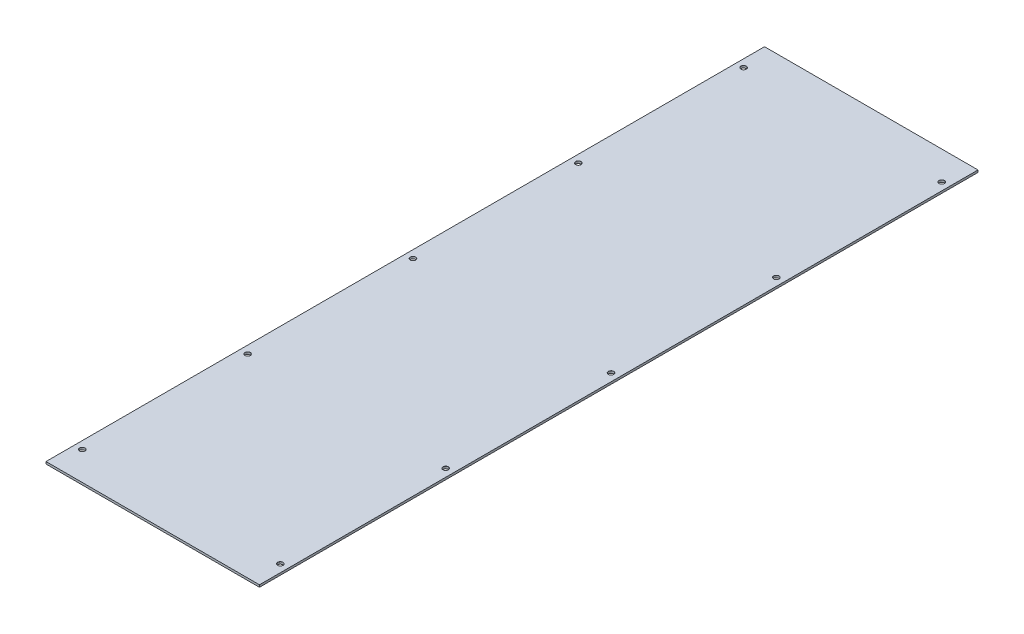
ISO-10303-21;
HEADER;
FILE_DESCRIPTION(('STEP AP214'),'2;1');
FILE_NAME('part.step','',(''),(''),'','','');
FILE_SCHEMA(('AUTOMOTIVE_DESIGN { 1 0 10303 214 1 1 1 1 }'));
ENDSEC;
DATA;
#1=APPLICATION_CONTEXT('core data for automotive mechanical design processes');
#2=APPLICATION_PROTOCOL_DEFINITION('international standard','automotive_design',2000,#1);
#3=PRODUCT_CONTEXT('',#1,'mechanical');
#4=PRODUCT('Part','Part','',(#3));
#5=PRODUCT_RELATED_PRODUCT_CATEGORY('part','',(#4));
#6=PRODUCT_DEFINITION_FORMATION('','',#4);
#7=PRODUCT_DEFINITION_CONTEXT('part definition',#1,'design');
#8=PRODUCT_DEFINITION('design','',#6,#7);
#9=PRODUCT_DEFINITION_SHAPE('','',#8);
#10=(LENGTH_UNIT() NAMED_UNIT(*) SI_UNIT(.MILLI.,.METRE.));
#11=(NAMED_UNIT(*) PLANE_ANGLE_UNIT() SI_UNIT($,.RADIAN.));
#12=(NAMED_UNIT(*) SI_UNIT($,.STERADIAN.) SOLID_ANGLE_UNIT());
#13=UNCERTAINTY_MEASURE_WITH_UNIT(LENGTH_MEASURE(1.E-05),#10,'distance_accuracy_value','');
#14=(GEOMETRIC_REPRESENTATION_CONTEXT(3) GLOBAL_UNCERTAINTY_ASSIGNED_CONTEXT((#13)) GLOBAL_UNIT_ASSIGNED_CONTEXT((#10,
#11,#12)) REPRESENTATION_CONTEXT('',''));
#15=CARTESIAN_POINT('',(0.,0.,0.));
#16=DIRECTION('',(0.,0.,1.));
#17=DIRECTION('',(1.,0.,0.));
#18=AXIS2_PLACEMENT_3D('',#15,#16,#17);
#19=CARTESIAN_POINT('',(0.,0.,326.5));
#20=DIRECTION('',(1.,0.,0.));
#21=DIRECTION('',(0.,0.,-1.));
#22=AXIS2_PLACEMENT_3D('',#19,#20,#21);
#23=PLANE('',#22);
#24=DIRECTION('',(0.,-1.,0.));
#25=VECTOR('',#24,1.);
#26=CARTESIAN_POINT('',(0.,0.,0.));
#27=LINE('',#26,#25);
#28=CARTESIAN_POINT('',(0.,1.,0.));
#29=VERTEX_POINT('',#28);
#30=CARTESIAN_POINT('',(0.,0.,0.));
#31=VERTEX_POINT('',#30);
#32=EDGE_CURVE('E113',#29,#31,#27,.T.);
#33=ORIENTED_EDGE('',*,*,#32,.T.);
#34=DIRECTION('',(0.,0.,-1.));
#35=VECTOR('',#34,1.);
#36=CARTESIAN_POINT('',(0.,0.,326.5));
#37=LINE('',#36,#35);
#38=CARTESIAN_POINT('',(0.,0.,326.5));
#39=VERTEX_POINT('',#38);
#40=EDGE_CURVE('E11',#39,#31,#37,.T.);
#41=ORIENTED_EDGE('',*,*,#40,.F.);
#42=DIRECTION('',(0.,-1.,0.));
#43=VECTOR('',#42,1.);
#44=CARTESIAN_POINT('',(0.,0.,326.5));
#45=LINE('',#44,#43);
#46=CARTESIAN_POINT('',(0.,1.,326.5));
#47=VERTEX_POINT('',#46);
#48=EDGE_CURVE('E97',#47,#39,#45,.T.);
#49=ORIENTED_EDGE('',*,*,#48,.F.);
#50=DIRECTION('',(0.,0.,-1.));
#51=VECTOR('',#50,1.);
#52=CARTESIAN_POINT('',(0.,1.,326.5));
#53=LINE('',#52,#51);
#54=EDGE_CURVE('E109',#47,#29,#53,.T.);
#55=ORIENTED_EDGE('',*,*,#54,.T.);
#56=EDGE_LOOP('',(#33,#41,#49,#55));
#57=FACE_BOUND('',#56,.T.);
#58=ADVANCED_FACE('F45',(#57),#23,.F.);
#59=CARTESIAN_POINT('',(0.,0.,326.5));
#60=DIRECTION('',(0.,1.,0.));
#61=DIRECTION('',(0.,0.,1.));
#62=AXIS2_PLACEMENT_3D('',#59,#60,#61);
#63=PLANE('',#62);
#64=CARTESIAN_POINT('',(3.5,0.,313.5));
#65=DIRECTION('',(0.,1.,0.));
#66=DIRECTION('',(0.,0.,1.));
#67=AXIS2_PLACEMENT_3D('',#64,#65,#66);
#68=CIRCLE('',#67,1.2);
#69=CARTESIAN_POINT('',(3.5,0.,314.7));
#70=VERTEX_POINT('',#69);
#71=EDGE_CURVE('E241',#70,#70,#68,.T.);
#72=ORIENTED_EDGE('',*,*,#71,.T.);
#73=EDGE_LOOP('',(#72));
#74=FACE_BOUND('',#73,.T.);
#75=CARTESIAN_POINT('',(93.5,0.,313.5));
#76=DIRECTION('',(0.,1.,0.));
#77=DIRECTION('',(0.,0.,1.));
#78=AXIS2_PLACEMENT_3D('',#75,#76,#77);
#79=CIRCLE('',#78,1.20000000000001);
#80=CARTESIAN_POINT('',(93.5,0.,314.7));
#81=VERTEX_POINT('',#80);
#82=EDGE_CURVE('E229',#81,#81,#79,.T.);
#83=ORIENTED_EDGE('',*,*,#82,.T.);
#84=EDGE_LOOP('',(#83));
#85=FACE_BOUND('',#84,.T.);
#86=CARTESIAN_POINT('',(3.5,0.,238.375));
#87=DIRECTION('',(0.,1.,0.));
#88=DIRECTION('',(0.,0.,1.));
#89=AXIS2_PLACEMENT_3D('',#86,#87,#88);
#90=CIRCLE('',#89,1.2);
#91=CARTESIAN_POINT('',(3.5,0.,239.575));
#92=VERTEX_POINT('',#91);
#93=EDGE_CURVE('E217',#92,#92,#90,.T.);
#94=ORIENTED_EDGE('',*,*,#93,.T.);
#95=EDGE_LOOP('',(#94));
#96=FACE_BOUND('',#95,.T.);
#97=CARTESIAN_POINT('',(93.5,0.,238.375));
#98=DIRECTION('',(0.,1.,0.));
#99=DIRECTION('',(0.,0.,1.));
#100=AXIS2_PLACEMENT_3D('',#97,#98,#99);
#101=CIRCLE('',#100,1.20000000000001);
#102=CARTESIAN_POINT('',(93.5,0.,239.575));
#103=VERTEX_POINT('',#102);
#104=EDGE_CURVE('E205',#103,#103,#101,.T.);
#105=ORIENTED_EDGE('',*,*,#104,.T.);
#106=EDGE_LOOP('',(#105));
#107=FACE_BOUND('',#106,.T.);
#108=CARTESIAN_POINT('',(3.5,0.,163.25));
#109=DIRECTION('',(0.,1.,0.));
#110=DIRECTION('',(0.,0.,1.));
#111=AXIS2_PLACEMENT_3D('',#108,#109,#110);
#112=CIRCLE('',#111,1.2);
#113=CARTESIAN_POINT('',(3.5,0.,164.45));
#114=VERTEX_POINT('',#113);
#115=EDGE_CURVE('E193',#114,#114,#112,.T.);
#116=ORIENTED_EDGE('',*,*,#115,.T.);
#117=EDGE_LOOP('',(#116));
#118=FACE_BOUND('',#117,.T.);
#119=CARTESIAN_POINT('',(93.5,0.,163.25));
#120=DIRECTION('',(0.,1.,0.));
#121=DIRECTION('',(0.,0.,1.));
#122=AXIS2_PLACEMENT_3D('',#119,#120,#121);
#123=CIRCLE('',#122,1.20000000000001);
#124=CARTESIAN_POINT('',(93.5,0.,164.45));
#125=VERTEX_POINT('',#124);
#126=EDGE_CURVE('E181',#125,#125,#123,.T.);
#127=ORIENTED_EDGE('',*,*,#126,.T.);
#128=EDGE_LOOP('',(#127));
#129=FACE_BOUND('',#128,.T.);
#130=CARTESIAN_POINT('',(3.5,0.,88.125));
#131=DIRECTION('',(0.,1.,0.));
#132=DIRECTION('',(0.,0.,1.));
#133=AXIS2_PLACEMENT_3D('',#130,#131,#132);
#134=CIRCLE('',#133,1.2);
#135=CARTESIAN_POINT('',(3.5,0.,89.325));
#136=VERTEX_POINT('',#135);
#137=EDGE_CURVE('E169',#136,#136,#134,.T.);
#138=ORIENTED_EDGE('',*,*,#137,.T.);
#139=EDGE_LOOP('',(#138));
#140=FACE_BOUND('',#139,.T.);
#141=CARTESIAN_POINT('',(93.5,0.,88.125));
#142=DIRECTION('',(0.,1.,0.));
#143=DIRECTION('',(0.,0.,1.));
#144=AXIS2_PLACEMENT_3D('',#141,#142,#143);
#145=CIRCLE('',#144,1.20000000000001);
#146=CARTESIAN_POINT('',(93.5,0.,89.325));
#147=VERTEX_POINT('',#146);
#148=EDGE_CURVE('E157',#147,#147,#145,.T.);
#149=ORIENTED_EDGE('',*,*,#148,.T.);
#150=EDGE_LOOP('',(#149));
#151=FACE_BOUND('',#150,.T.);
#152=CARTESIAN_POINT('',(3.5,0.,13.));
#153=DIRECTION('',(0.,1.,0.));
#154=DIRECTION('',(0.,0.,1.));
#155=AXIS2_PLACEMENT_3D('',#152,#153,#154);
#156=CIRCLE('',#155,1.2);
#157=CARTESIAN_POINT('',(3.5,0.,14.2));
#158=VERTEX_POINT('',#157);
#159=EDGE_CURVE('E145',#158,#158,#156,.T.);
#160=ORIENTED_EDGE('',*,*,#159,.T.);
#161=EDGE_LOOP('',(#160));
#162=FACE_BOUND('',#161,.T.);
#163=CARTESIAN_POINT('',(93.5,0.,13.));
#164=DIRECTION('',(0.,1.,0.));
#165=DIRECTION('',(0.,0.,1.));
#166=AXIS2_PLACEMENT_3D('',#163,#164,#165);
#167=CIRCLE('',#166,1.20000000000001);
#168=CARTESIAN_POINT('',(93.5,0.,14.2));
#169=VERTEX_POINT('',#168);
#170=EDGE_CURVE('E117',#169,#169,#167,.T.);
#171=ORIENTED_EDGE('',*,*,#170,.T.);
#172=EDGE_LOOP('',(#171));
#173=FACE_BOUND('',#172,.T.);
#174=DIRECTION('',(1.,0.,0.));
#175=VECTOR('',#174,1.);
#176=CARTESIAN_POINT('',(0.,0.,0.));
#177=LINE('',#176,#175);
#178=CARTESIAN_POINT('',(97.,0.,0.));
#179=VERTEX_POINT('',#178);
#180=EDGE_CURVE('E102',#31,#179,#177,.T.);
#181=ORIENTED_EDGE('',*,*,#180,.T.);
#182=DIRECTION('',(0.,0.,-1.));
#183=VECTOR('',#182,1.);
#184=CARTESIAN_POINT('',(97.,0.,326.5));
#185=LINE('',#184,#183);
#186=CARTESIAN_POINT('',(97.,0.,326.5));
#187=VERTEX_POINT('',#186);
#188=EDGE_CURVE('E54',#187,#179,#185,.T.);
#189=ORIENTED_EDGE('',*,*,#188,.F.);
#190=DIRECTION('',(1.,0.,0.));
#191=VECTOR('',#190,1.);
#192=CARTESIAN_POINT('',(0.,0.,326.5));
#193=LINE('',#192,#191);
#194=EDGE_CURVE('E92',#39,#187,#193,.T.);
#195=ORIENTED_EDGE('',*,*,#194,.F.);
#196=ORIENTED_EDGE('',*,*,#40,.T.);
#197=EDGE_LOOP('',(#181,#189,#195,#196));
#198=FACE_BOUND('',#197,.T.);
#199=ADVANCED_FACE('F101',(#74,#85,#96,#107,#118,#129,#140,#151,#162,#173,#198),#63,.F.);
#200=CARTESIAN_POINT('',(97.,0.,326.5));
#201=DIRECTION('',(-1.,0.,0.));
#202=DIRECTION('',(0.,0.,1.));
#203=AXIS2_PLACEMENT_3D('',#200,#201,#202);
#204=PLANE('',#203);
#205=DIRECTION('',(0.,1.,0.));
#206=VECTOR('',#205,1.);
#207=CARTESIAN_POINT('',(97.,0.,0.));
#208=LINE('',#207,#206);
#209=CARTESIAN_POINT('',(97.,1.,0.));
#210=VERTEX_POINT('',#209);
#211=EDGE_CURVE('E79',#179,#210,#208,.T.);
#212=ORIENTED_EDGE('',*,*,#211,.T.);
#213=DIRECTION('',(0.,0.,-1.));
#214=VECTOR('',#213,1.);
#215=CARTESIAN_POINT('',(97.,1.,326.5));
#216=LINE('',#215,#214);
#217=CARTESIAN_POINT('',(97.,1.,326.5));
#218=VERTEX_POINT('',#217);
#219=EDGE_CURVE('E104',#218,#210,#216,.T.);
#220=ORIENTED_EDGE('',*,*,#219,.F.);
#221=DIRECTION('',(0.,1.,0.));
#222=VECTOR('',#221,1.);
#223=CARTESIAN_POINT('',(97.,0.,326.5));
#224=LINE('',#223,#222);
#225=EDGE_CURVE('E95',#187,#218,#224,.T.);
#226=ORIENTED_EDGE('',*,*,#225,.F.);
#227=ORIENTED_EDGE('',*,*,#188,.T.);
#228=EDGE_LOOP('',(#212,#220,#226,#227));
#229=FACE_BOUND('',#228,.T.);
#230=ADVANCED_FACE('F105',(#229),#204,.F.);
#231=CARTESIAN_POINT('',(0.,1.,326.5));
#232=DIRECTION('',(0.,-1.,0.));
#233=DIRECTION('',(0.,0.,-1.));
#234=AXIS2_PLACEMENT_3D('',#231,#232,#233);
#235=PLANE('',#234);
#236=CARTESIAN_POINT('',(3.5,1.,313.5));
#237=DIRECTION('',(0.,1.,0.));
#238=DIRECTION('',(0.,0.,1.));
#239=AXIS2_PLACEMENT_3D('',#236,#237,#238);
#240=CIRCLE('',#239,1.225);
#241=CARTESIAN_POINT('',(3.5,1.,314.725));
#242=VERTEX_POINT('',#241);
#243=EDGE_CURVE('E249',#242,#242,#240,.T.);
#244=ORIENTED_EDGE('',*,*,#243,.F.);
#245=EDGE_LOOP('',(#244));
#246=FACE_BOUND('',#245,.T.);
#247=CARTESIAN_POINT('',(93.5,1.,313.5));
#248=DIRECTION('',(0.,1.,0.));
#249=DIRECTION('',(0.,0.,1.));
#250=AXIS2_PLACEMENT_3D('',#247,#248,#249);
#251=CIRCLE('',#250,1.225);
#252=CARTESIAN_POINT('',(93.5,1.,314.725));
#253=VERTEX_POINT('',#252);
#254=EDGE_CURVE('E237',#253,#253,#251,.T.);
#255=ORIENTED_EDGE('',*,*,#254,.F.);
#256=EDGE_LOOP('',(#255));
#257=FACE_BOUND('',#256,.T.);
#258=CARTESIAN_POINT('',(3.5,1.,238.375));
#259=DIRECTION('',(0.,1.,0.));
#260=DIRECTION('',(0.,0.,1.));
#261=AXIS2_PLACEMENT_3D('',#258,#259,#260);
#262=CIRCLE('',#261,1.225);
#263=CARTESIAN_POINT('',(3.5,1.,239.6));
#264=VERTEX_POINT('',#263);
#265=EDGE_CURVE('E225',#264,#264,#262,.T.);
#266=ORIENTED_EDGE('',*,*,#265,.F.);
#267=EDGE_LOOP('',(#266));
#268=FACE_BOUND('',#267,.T.);
#269=CARTESIAN_POINT('',(93.5,1.,238.375));
#270=DIRECTION('',(0.,1.,0.));
#271=DIRECTION('',(0.,0.,1.));
#272=AXIS2_PLACEMENT_3D('',#269,#270,#271);
#273=CIRCLE('',#272,1.225);
#274=CARTESIAN_POINT('',(93.5,1.,239.6));
#275=VERTEX_POINT('',#274);
#276=EDGE_CURVE('E213',#275,#275,#273,.T.);
#277=ORIENTED_EDGE('',*,*,#276,.F.);
#278=EDGE_LOOP('',(#277));
#279=FACE_BOUND('',#278,.T.);
#280=CARTESIAN_POINT('',(3.5,1.,163.25));
#281=DIRECTION('',(0.,1.,0.));
#282=DIRECTION('',(0.,0.,1.));
#283=AXIS2_PLACEMENT_3D('',#280,#281,#282);
#284=CIRCLE('',#283,1.225);
#285=CARTESIAN_POINT('',(3.5,1.,164.475));
#286=VERTEX_POINT('',#285);
#287=EDGE_CURVE('E201',#286,#286,#284,.T.);
#288=ORIENTED_EDGE('',*,*,#287,.F.);
#289=EDGE_LOOP('',(#288));
#290=FACE_BOUND('',#289,.T.);
#291=CARTESIAN_POINT('',(93.5,1.,163.25));
#292=DIRECTION('',(0.,1.,0.));
#293=DIRECTION('',(0.,0.,1.));
#294=AXIS2_PLACEMENT_3D('',#291,#292,#293);
#295=CIRCLE('',#294,1.225);
#296=CARTESIAN_POINT('',(93.5,1.,164.475));
#297=VERTEX_POINT('',#296);
#298=EDGE_CURVE('E189',#297,#297,#295,.T.);
#299=ORIENTED_EDGE('',*,*,#298,.F.);
#300=EDGE_LOOP('',(#299));
#301=FACE_BOUND('',#300,.T.);
#302=CARTESIAN_POINT('',(3.5,1.,88.125));
#303=DIRECTION('',(0.,1.,0.));
#304=DIRECTION('',(0.,0.,1.));
#305=AXIS2_PLACEMENT_3D('',#302,#303,#304);
#306=CIRCLE('',#305,1.225);
#307=CARTESIAN_POINT('',(3.5,1.,89.35));
#308=VERTEX_POINT('',#307);
#309=EDGE_CURVE('E177',#308,#308,#306,.T.);
#310=ORIENTED_EDGE('',*,*,#309,.F.);
#311=EDGE_LOOP('',(#310));
#312=FACE_BOUND('',#311,.T.);
#313=CARTESIAN_POINT('',(93.5,1.,88.125));
#314=DIRECTION('',(0.,1.,0.));
#315=DIRECTION('',(0.,0.,1.));
#316=AXIS2_PLACEMENT_3D('',#313,#314,#315);
#317=CIRCLE('',#316,1.225);
#318=CARTESIAN_POINT('',(93.5,1.,89.35));
#319=VERTEX_POINT('',#318);
#320=EDGE_CURVE('E165',#319,#319,#317,.T.);
#321=ORIENTED_EDGE('',*,*,#320,.F.);
#322=EDGE_LOOP('',(#321));
#323=FACE_BOUND('',#322,.T.);
#324=CARTESIAN_POINT('',(3.5,1.,13.));
#325=DIRECTION('',(0.,1.,0.));
#326=DIRECTION('',(0.,0.,1.));
#327=AXIS2_PLACEMENT_3D('',#324,#325,#326);
#328=CIRCLE('',#327,1.225);
#329=CARTESIAN_POINT('',(3.5,1.,14.225));
#330=VERTEX_POINT('',#329);
#331=EDGE_CURVE('E153',#330,#330,#328,.T.);
#332=ORIENTED_EDGE('',*,*,#331,.F.);
#333=EDGE_LOOP('',(#332));
#334=FACE_BOUND('',#333,.T.);
#335=CARTESIAN_POINT('',(93.5,1.,13.));
#336=DIRECTION('',(0.,1.,0.));
#337=DIRECTION('',(0.,0.,1.));
#338=AXIS2_PLACEMENT_3D('',#335,#336,#337);
#339=CIRCLE('',#338,1.225);
#340=CARTESIAN_POINT('',(93.5,1.,14.225));
#341=VERTEX_POINT('',#340);
#342=EDGE_CURVE('E141',#341,#341,#339,.T.);
#343=ORIENTED_EDGE('',*,*,#342,.F.);
#344=EDGE_LOOP('',(#343));
#345=FACE_BOUND('',#344,.T.);
#346=DIRECTION('',(-1.,0.,0.));
#347=VECTOR('',#346,1.);
#348=CARTESIAN_POINT('',(0.,1.,0.));
#349=LINE('',#348,#347);
#350=EDGE_CURVE('E85',#210,#29,#349,.T.);
#351=ORIENTED_EDGE('',*,*,#350,.T.);
#352=ORIENTED_EDGE('',*,*,#54,.F.);
#353=DIRECTION('',(-1.,0.,0.));
#354=VECTOR('',#353,1.);
#355=CARTESIAN_POINT('',(0.,1.,326.5));
#356=LINE('',#355,#354);
#357=EDGE_CURVE('E62',#218,#47,#356,.T.);
#358=ORIENTED_EDGE('',*,*,#357,.F.);
#359=ORIENTED_EDGE('',*,*,#219,.T.);
#360=EDGE_LOOP('',(#351,#352,#358,#359));
#361=FACE_BOUND('',#360,.T.);
#362=ADVANCED_FACE('F127',(#246,#257,#268,#279,#290,#301,#312,#323,#334,#345,#361),#235,.F.);
#363=CARTESIAN_POINT('',(0.,0.,326.5));
#364=DIRECTION('',(0.,0.,-1.));
#365=DIRECTION('',(-1.,0.,0.));
#366=AXIS2_PLACEMENT_3D('',#363,#364,#365);
#367=PLANE('',#366);
#368=ORIENTED_EDGE('',*,*,#48,.T.);
#369=ORIENTED_EDGE('',*,*,#194,.T.);
#370=ORIENTED_EDGE('',*,*,#225,.T.);
#371=ORIENTED_EDGE('',*,*,#357,.T.);
#372=EDGE_LOOP('',(#368,#369,#370,#371));
#373=FACE_BOUND('',#372,.T.);
#374=ADVANCED_FACE('F93',(#373),#367,.F.);
#375=CARTESIAN_POINT('',(0.,0.,0.));
#376=DIRECTION('',(0.,0.,-1.));
#377=DIRECTION('',(-1.,0.,0.));
#378=AXIS2_PLACEMENT_3D('',#375,#376,#377);
#379=PLANE('',#378);
#380=ORIENTED_EDGE('',*,*,#32,.F.);
#381=ORIENTED_EDGE('',*,*,#350,.F.);
#382=ORIENTED_EDGE('',*,*,#211,.F.);
#383=ORIENTED_EDGE('',*,*,#180,.F.);
#384=EDGE_LOOP('',(#380,#381,#382,#383));
#385=FACE_BOUND('',#384,.T.);
#386=ADVANCED_FACE('F130',(#385),#379,.T.);
#387=CARTESIAN_POINT('',(93.5,1.,13.));
#388=DIRECTION('',(0.,1.,0.));
#389=DIRECTION('',(0.,0.,1.));
#390=AXIS2_PLACEMENT_3D('',#387,#388,#389);
#391=CYLINDRICAL_SURFACE('',#390,1.20000000000001);
#392=ORIENTED_EDGE('',*,*,#170,.F.);
#393=EDGE_LOOP('',(#392));
#394=FACE_BOUND('',#393,.T.);
#395=CARTESIAN_POINT('',(93.5,0.974999999999999,13.));
#396=DIRECTION('',(0.,1.,0.));
#397=DIRECTION('',(0.,0.,1.));
#398=AXIS2_PLACEMENT_3D('',#395,#396,#397);
#399=CIRCLE('',#398,1.20000000000001);
#400=CARTESIAN_POINT('',(93.5,0.974999999999999,14.2));
#401=VERTEX_POINT('',#400);
#402=EDGE_CURVE('E137',#401,#401,#399,.T.);
#403=ORIENTED_EDGE('',*,*,#402,.T.);
#404=EDGE_LOOP('',(#403));
#405=FACE_BOUND('',#404,.T.);
#406=ADVANCED_FACE('F280',(#394,#405),#391,.F.);
#407=CARTESIAN_POINT('',(93.5,1.,13.));
#408=DIRECTION('',(0.,1.,0.));
#409=DIRECTION('',(0.,0.,1.));
#410=AXIS2_PLACEMENT_3D('',#407,#408,#409);
#411=CONICAL_SURFACE('',#410,1.225,0.785398163397377);
#412=ORIENTED_EDGE('',*,*,#402,.F.);
#413=EDGE_LOOP('',(#412));
#414=FACE_BOUND('',#413,.T.);
#415=ORIENTED_EDGE('',*,*,#342,.T.);
#416=EDGE_LOOP('',(#415));
#417=FACE_BOUND('',#416,.T.);
#418=ADVANCED_FACE('F277',(#414,#417),#411,.F.);
#419=CARTESIAN_POINT('',(3.5,1.,13.));
#420=DIRECTION('',(0.,1.,0.));
#421=DIRECTION('',(0.,0.,1.));
#422=AXIS2_PLACEMENT_3D('',#419,#420,#421);
#423=CYLINDRICAL_SURFACE('',#422,1.2);
#424=ORIENTED_EDGE('',*,*,#159,.F.);
#425=EDGE_LOOP('',(#424));
#426=FACE_BOUND('',#425,.T.);
#427=CARTESIAN_POINT('',(3.5,0.974999999999999,13.));
#428=DIRECTION('',(0.,1.,0.));
#429=DIRECTION('',(0.,0.,1.));
#430=AXIS2_PLACEMENT_3D('',#427,#428,#429);
#431=CIRCLE('',#430,1.2);
#432=CARTESIAN_POINT('',(3.5,0.974999999999999,14.2));
#433=VERTEX_POINT('',#432);
#434=EDGE_CURVE('E149',#433,#433,#431,.T.);
#435=ORIENTED_EDGE('',*,*,#434,.T.);
#436=EDGE_LOOP('',(#435));
#437=FACE_BOUND('',#436,.T.);
#438=ADVANCED_FACE('F279',(#426,#437),#423,.F.);
#439=CARTESIAN_POINT('',(3.5,1.,13.));
#440=DIRECTION('',(0.,1.,0.));
#441=DIRECTION('',(0.,0.,1.));
#442=AXIS2_PLACEMENT_3D('',#439,#440,#441);
#443=CONICAL_SURFACE('',#442,1.225,0.785398163397446);
#444=ORIENTED_EDGE('',*,*,#434,.F.);
#445=EDGE_LOOP('',(#444));
#446=FACE_BOUND('',#445,.T.);
#447=ORIENTED_EDGE('',*,*,#331,.T.);
#448=EDGE_LOOP('',(#447));
#449=FACE_BOUND('',#448,.T.);
#450=ADVANCED_FACE('F287',(#446,#449),#443,.F.);
#451=CARTESIAN_POINT('',(93.5,1.,88.125));
#452=DIRECTION('',(0.,1.,0.));
#453=DIRECTION('',(0.,0.,1.));
#454=AXIS2_PLACEMENT_3D('',#451,#452,#453);
#455=CYLINDRICAL_SURFACE('',#454,1.20000000000001);
#456=ORIENTED_EDGE('',*,*,#148,.F.);
#457=EDGE_LOOP('',(#456));
#458=FACE_BOUND('',#457,.T.);
#459=CARTESIAN_POINT('',(93.5,0.974999999999999,88.125));
#460=DIRECTION('',(0.,1.,0.));
#461=DIRECTION('',(0.,0.,1.));
#462=AXIS2_PLACEMENT_3D('',#459,#460,#461);
#463=CIRCLE('',#462,1.20000000000001);
#464=CARTESIAN_POINT('',(93.5,0.974999999999999,89.325));
#465=VERTEX_POINT('',#464);
#466=EDGE_CURVE('E161',#465,#465,#463,.T.);
#467=ORIENTED_EDGE('',*,*,#466,.T.);
#468=EDGE_LOOP('',(#467));
#469=FACE_BOUND('',#468,.T.);
#470=ADVANCED_FACE('F343',(#458,#469),#455,.F.);
#471=CARTESIAN_POINT('',(93.5,1.,88.125));
#472=DIRECTION('',(0.,1.,0.));
#473=DIRECTION('',(0.,0.,1.));
#474=AXIS2_PLACEMENT_3D('',#471,#472,#473);
#475=CONICAL_SURFACE('',#474,1.225,0.785398163397377);
#476=ORIENTED_EDGE('',*,*,#466,.F.);
#477=EDGE_LOOP('',(#476));
#478=FACE_BOUND('',#477,.T.);
#479=ORIENTED_EDGE('',*,*,#320,.T.);
#480=EDGE_LOOP('',(#479));
#481=FACE_BOUND('',#480,.T.);
#482=ADVANCED_FACE('F353',(#478,#481),#475,.F.);
#483=CARTESIAN_POINT('',(3.5,1.,88.125));
#484=DIRECTION('',(0.,1.,0.));
#485=DIRECTION('',(0.,0.,1.));
#486=AXIS2_PLACEMENT_3D('',#483,#484,#485);
#487=CYLINDRICAL_SURFACE('',#486,1.2);
#488=ORIENTED_EDGE('',*,*,#137,.F.);
#489=EDGE_LOOP('',(#488));
#490=FACE_BOUND('',#489,.T.);
#491=CARTESIAN_POINT('',(3.5,0.974999999999999,88.125));
#492=DIRECTION('',(0.,1.,0.));
#493=DIRECTION('',(0.,0.,1.));
#494=AXIS2_PLACEMENT_3D('',#491,#492,#493);
#495=CIRCLE('',#494,1.2);
#496=CARTESIAN_POINT('',(3.5,0.974999999999999,89.325));
#497=VERTEX_POINT('',#496);
#498=EDGE_CURVE('E173',#497,#497,#495,.T.);
#499=ORIENTED_EDGE('',*,*,#498,.T.);
#500=EDGE_LOOP('',(#499));
#501=FACE_BOUND('',#500,.T.);
#502=ADVANCED_FACE('F363',(#490,#501),#487,.F.);
#503=CARTESIAN_POINT('',(3.5,1.,88.125));
#504=DIRECTION('',(0.,1.,0.));
#505=DIRECTION('',(0.,0.,1.));
#506=AXIS2_PLACEMENT_3D('',#503,#504,#505);
#507=CONICAL_SURFACE('',#506,1.225,0.785398163397446);
#508=ORIENTED_EDGE('',*,*,#498,.F.);
#509=EDGE_LOOP('',(#508));
#510=FACE_BOUND('',#509,.T.);
#511=ORIENTED_EDGE('',*,*,#309,.T.);
#512=EDGE_LOOP('',(#511));
#513=FACE_BOUND('',#512,.T.);
#514=ADVANCED_FACE('F373',(#510,#513),#507,.F.);
#515=CARTESIAN_POINT('',(93.5,1.,163.25));
#516=DIRECTION('',(0.,1.,0.));
#517=DIRECTION('',(0.,0.,1.));
#518=AXIS2_PLACEMENT_3D('',#515,#516,#517);
#519=CYLINDRICAL_SURFACE('',#518,1.20000000000001);
#520=ORIENTED_EDGE('',*,*,#126,.F.);
#521=EDGE_LOOP('',(#520));
#522=FACE_BOUND('',#521,.T.);
#523=CARTESIAN_POINT('',(93.5,0.974999999999999,163.25));
#524=DIRECTION('',(0.,1.,0.));
#525=DIRECTION('',(0.,0.,1.));
#526=AXIS2_PLACEMENT_3D('',#523,#524,#525);
#527=CIRCLE('',#526,1.20000000000001);
#528=CARTESIAN_POINT('',(93.5,0.974999999999999,164.45));
#529=VERTEX_POINT('',#528);
#530=EDGE_CURVE('E185',#529,#529,#527,.T.);
#531=ORIENTED_EDGE('',*,*,#530,.T.);
#532=EDGE_LOOP('',(#531));
#533=FACE_BOUND('',#532,.T.);
#534=ADVANCED_FACE('F383',(#522,#533),#519,.F.);
#535=CARTESIAN_POINT('',(93.5,1.,163.25));
#536=DIRECTION('',(0.,1.,0.));
#537=DIRECTION('',(0.,0.,1.));
#538=AXIS2_PLACEMENT_3D('',#535,#536,#537);
#539=CONICAL_SURFACE('',#538,1.225,0.785398163397377);
#540=ORIENTED_EDGE('',*,*,#530,.F.);
#541=EDGE_LOOP('',(#540));
#542=FACE_BOUND('',#541,.T.);
#543=ORIENTED_EDGE('',*,*,#298,.T.);
#544=EDGE_LOOP('',(#543));
#545=FACE_BOUND('',#544,.T.);
#546=ADVANCED_FACE('F393',(#542,#545),#539,.F.);
#547=CARTESIAN_POINT('',(3.5,1.,163.25));
#548=DIRECTION('',(0.,1.,0.));
#549=DIRECTION('',(0.,0.,1.));
#550=AXIS2_PLACEMENT_3D('',#547,#548,#549);
#551=CYLINDRICAL_SURFACE('',#550,1.2);
#552=ORIENTED_EDGE('',*,*,#115,.F.);
#553=EDGE_LOOP('',(#552));
#554=FACE_BOUND('',#553,.T.);
#555=CARTESIAN_POINT('',(3.5,0.974999999999999,163.25));
#556=DIRECTION('',(0.,1.,0.));
#557=DIRECTION('',(0.,0.,1.));
#558=AXIS2_PLACEMENT_3D('',#555,#556,#557);
#559=CIRCLE('',#558,1.2);
#560=CARTESIAN_POINT('',(3.5,0.974999999999999,164.45));
#561=VERTEX_POINT('',#560);
#562=EDGE_CURVE('E197',#561,#561,#559,.T.);
#563=ORIENTED_EDGE('',*,*,#562,.T.);
#564=EDGE_LOOP('',(#563));
#565=FACE_BOUND('',#564,.T.);
#566=ADVANCED_FACE('F403',(#554,#565),#551,.F.);
#567=CARTESIAN_POINT('',(3.5,1.,163.25));
#568=DIRECTION('',(0.,1.,0.));
#569=DIRECTION('',(0.,0.,1.));
#570=AXIS2_PLACEMENT_3D('',#567,#568,#569);
#571=CONICAL_SURFACE('',#570,1.225,0.785398163397446);
#572=ORIENTED_EDGE('',*,*,#562,.F.);
#573=EDGE_LOOP('',(#572));
#574=FACE_BOUND('',#573,.T.);
#575=ORIENTED_EDGE('',*,*,#287,.T.);
#576=EDGE_LOOP('',(#575));
#577=FACE_BOUND('',#576,.T.);
#578=ADVANCED_FACE('F413',(#574,#577),#571,.F.);
#579=CARTESIAN_POINT('',(93.5,1.,238.375));
#580=DIRECTION('',(0.,1.,0.));
#581=DIRECTION('',(0.,0.,1.));
#582=AXIS2_PLACEMENT_3D('',#579,#580,#581);
#583=CYLINDRICAL_SURFACE('',#582,1.20000000000001);
#584=ORIENTED_EDGE('',*,*,#104,.F.);
#585=EDGE_LOOP('',(#584));
#586=FACE_BOUND('',#585,.T.);
#587=CARTESIAN_POINT('',(93.5,0.974999999999999,238.375));
#588=DIRECTION('',(0.,1.,0.));
#589=DIRECTION('',(0.,0.,1.));
#590=AXIS2_PLACEMENT_3D('',#587,#588,#589);
#591=CIRCLE('',#590,1.20000000000001);
#592=CARTESIAN_POINT('',(93.5,0.974999999999999,239.575));
#593=VERTEX_POINT('',#592);
#594=EDGE_CURVE('E209',#593,#593,#591,.T.);
#595=ORIENTED_EDGE('',*,*,#594,.T.);
#596=EDGE_LOOP('',(#595));
#597=FACE_BOUND('',#596,.T.);
#598=ADVANCED_FACE('F423',(#586,#597),#583,.F.);
#599=CARTESIAN_POINT('',(93.5,1.,238.375));
#600=DIRECTION('',(0.,1.,0.));
#601=DIRECTION('',(0.,0.,1.));
#602=AXIS2_PLACEMENT_3D('',#599,#600,#601);
#603=CONICAL_SURFACE('',#602,1.225,0.785398163397377);
#604=ORIENTED_EDGE('',*,*,#594,.F.);
#605=EDGE_LOOP('',(#604));
#606=FACE_BOUND('',#605,.T.);
#607=ORIENTED_EDGE('',*,*,#276,.T.);
#608=EDGE_LOOP('',(#607));
#609=FACE_BOUND('',#608,.T.);
#610=ADVANCED_FACE('F433',(#606,#609),#603,.F.);
#611=CARTESIAN_POINT('',(3.5,1.,238.375));
#612=DIRECTION('',(0.,1.,0.));
#613=DIRECTION('',(0.,0.,1.));
#614=AXIS2_PLACEMENT_3D('',#611,#612,#613);
#615=CYLINDRICAL_SURFACE('',#614,1.2);
#616=ORIENTED_EDGE('',*,*,#93,.F.);
#617=EDGE_LOOP('',(#616));
#618=FACE_BOUND('',#617,.T.);
#619=CARTESIAN_POINT('',(3.5,0.974999999999999,238.375));
#620=DIRECTION('',(0.,1.,0.));
#621=DIRECTION('',(0.,0.,1.));
#622=AXIS2_PLACEMENT_3D('',#619,#620,#621);
#623=CIRCLE('',#622,1.2);
#624=CARTESIAN_POINT('',(3.5,0.974999999999999,239.575));
#625=VERTEX_POINT('',#624);
#626=EDGE_CURVE('E221',#625,#625,#623,.T.);
#627=ORIENTED_EDGE('',*,*,#626,.T.);
#628=EDGE_LOOP('',(#627));
#629=FACE_BOUND('',#628,.T.);
#630=ADVANCED_FACE('F443',(#618,#629),#615,.F.);
#631=CARTESIAN_POINT('',(3.5,1.,238.375));
#632=DIRECTION('',(0.,1.,0.));
#633=DIRECTION('',(0.,0.,1.));
#634=AXIS2_PLACEMENT_3D('',#631,#632,#633);
#635=CONICAL_SURFACE('',#634,1.225,0.785398163397446);
#636=ORIENTED_EDGE('',*,*,#626,.F.);
#637=EDGE_LOOP('',(#636));
#638=FACE_BOUND('',#637,.T.);
#639=ORIENTED_EDGE('',*,*,#265,.T.);
#640=EDGE_LOOP('',(#639));
#641=FACE_BOUND('',#640,.T.);
#642=ADVANCED_FACE('F453',(#638,#641),#635,.F.);
#643=CARTESIAN_POINT('',(93.5,1.,313.5));
#644=DIRECTION('',(0.,1.,0.));
#645=DIRECTION('',(0.,0.,1.));
#646=AXIS2_PLACEMENT_3D('',#643,#644,#645);
#647=CYLINDRICAL_SURFACE('',#646,1.20000000000001);
#648=ORIENTED_EDGE('',*,*,#82,.F.);
#649=EDGE_LOOP('',(#648));
#650=FACE_BOUND('',#649,.T.);
#651=CARTESIAN_POINT('',(93.5,0.974999999999999,313.5));
#652=DIRECTION('',(0.,1.,0.));
#653=DIRECTION('',(0.,0.,1.));
#654=AXIS2_PLACEMENT_3D('',#651,#652,#653);
#655=CIRCLE('',#654,1.20000000000001);
#656=CARTESIAN_POINT('',(93.5,0.974999999999999,314.7));
#657=VERTEX_POINT('',#656);
#658=EDGE_CURVE('E233',#657,#657,#655,.T.);
#659=ORIENTED_EDGE('',*,*,#658,.T.);
#660=EDGE_LOOP('',(#659));
#661=FACE_BOUND('',#660,.T.);
#662=ADVANCED_FACE('F463',(#650,#661),#647,.F.);
#663=CARTESIAN_POINT('',(93.5,1.,313.5));
#664=DIRECTION('',(0.,1.,0.));
#665=DIRECTION('',(0.,0.,1.));
#666=AXIS2_PLACEMENT_3D('',#663,#664,#665);
#667=CONICAL_SURFACE('',#666,1.225,0.785398163397377);
#668=ORIENTED_EDGE('',*,*,#658,.F.);
#669=EDGE_LOOP('',(#668));
#670=FACE_BOUND('',#669,.T.);
#671=ORIENTED_EDGE('',*,*,#254,.T.);
#672=EDGE_LOOP('',(#671));
#673=FACE_BOUND('',#672,.T.);
#674=ADVANCED_FACE('F473',(#670,#673),#667,.F.);
#675=CARTESIAN_POINT('',(3.5,1.,313.5));
#676=DIRECTION('',(0.,1.,0.));
#677=DIRECTION('',(0.,0.,1.));
#678=AXIS2_PLACEMENT_3D('',#675,#676,#677);
#679=CYLINDRICAL_SURFACE('',#678,1.2);
#680=ORIENTED_EDGE('',*,*,#71,.F.);
#681=EDGE_LOOP('',(#680));
#682=FACE_BOUND('',#681,.T.);
#683=CARTESIAN_POINT('',(3.5,0.974999999999999,313.5));
#684=DIRECTION('',(0.,1.,0.));
#685=DIRECTION('',(0.,0.,1.));
#686=AXIS2_PLACEMENT_3D('',#683,#684,#685);
#687=CIRCLE('',#686,1.2);
#688=CARTESIAN_POINT('',(3.5,0.974999999999999,314.7));
#689=VERTEX_POINT('',#688);
#690=EDGE_CURVE('E245',#689,#689,#687,.T.);
#691=ORIENTED_EDGE('',*,*,#690,.T.);
#692=EDGE_LOOP('',(#691));
#693=FACE_BOUND('',#692,.T.);
#694=ADVANCED_FACE('F483',(#682,#693),#679,.F.);
#695=CARTESIAN_POINT('',(3.5,1.,313.5));
#696=DIRECTION('',(0.,1.,0.));
#697=DIRECTION('',(0.,0.,1.));
#698=AXIS2_PLACEMENT_3D('',#695,#696,#697);
#699=CONICAL_SURFACE('',#698,1.225,0.785398163397446);
#700=ORIENTED_EDGE('',*,*,#690,.F.);
#701=EDGE_LOOP('',(#700));
#702=FACE_BOUND('',#701,.T.);
#703=ORIENTED_EDGE('',*,*,#243,.T.);
#704=EDGE_LOOP('',(#703));
#705=FACE_BOUND('',#704,.T.);
#706=ADVANCED_FACE('F254',(#702,#705),#699,.F.);
#707=CLOSED_SHELL('',(#58,#199,#230,#362,#374,#386,#406,#418,#438,#450,#470,#482,#502,#514,#534,
#546,#566,#578,#598,#610,#630,#642,#662,#674,#694,#706));
#708=MANIFOLD_SOLID_BREP('B2',#707);
#709=ADVANCED_BREP_SHAPE_REPRESENTATION('',(#18,#708),#14);
#710=SHAPE_DEFINITION_REPRESENTATION(#9,#709);
ENDSEC;
END-ISO-10303-21;
